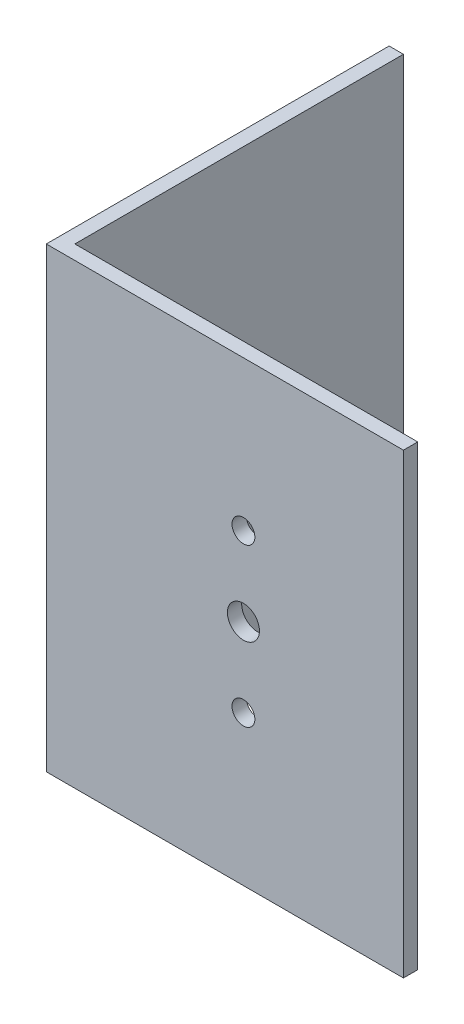
ISO-10303-21;
HEADER;
FILE_DESCRIPTION(('STEP AP214'),'2;1');
FILE_NAME('part.step','',(''),(''),'','','');
FILE_SCHEMA(('AUTOMOTIVE_DESIGN { 1 0 10303 214 1 1 1 1 }'));
ENDSEC;
DATA;
#1=APPLICATION_CONTEXT('core data for automotive mechanical design processes');
#2=APPLICATION_PROTOCOL_DEFINITION('international standard','automotive_design',2000,#1);
#3=PRODUCT_CONTEXT('',#1,'mechanical');
#4=PRODUCT('Part','Part','',(#3));
#5=PRODUCT_RELATED_PRODUCT_CATEGORY('part','',(#4));
#6=PRODUCT_DEFINITION_FORMATION('','',#4);
#7=PRODUCT_DEFINITION_CONTEXT('part definition',#1,'design');
#8=PRODUCT_DEFINITION('design','',#6,#7);
#9=PRODUCT_DEFINITION_SHAPE('','',#8);
#10=(LENGTH_UNIT() NAMED_UNIT(*) SI_UNIT(.MILLI.,.METRE.));
#11=(NAMED_UNIT(*) PLANE_ANGLE_UNIT() SI_UNIT($,.RADIAN.));
#12=(NAMED_UNIT(*) SI_UNIT($,.STERADIAN.) SOLID_ANGLE_UNIT());
#13=UNCERTAINTY_MEASURE_WITH_UNIT(LENGTH_MEASURE(1.E-05),#10,'distance_accuracy_value','');
#14=(GEOMETRIC_REPRESENTATION_CONTEXT(3) GLOBAL_UNCERTAINTY_ASSIGNED_CONTEXT((#13)) GLOBAL_UNIT_ASSIGNED_CONTEXT((#10,
#11,#12)) REPRESENTATION_CONTEXT('',''));
#15=CARTESIAN_POINT('',(0.,0.,0.));
#16=DIRECTION('',(0.,0.,1.));
#17=DIRECTION('',(1.,0.,0.));
#18=AXIS2_PLACEMENT_3D('',#15,#16,#17);
#19=CARTESIAN_POINT('',(1.5875,-25.4,19.05));
#20=DIRECTION('',(0.,0.,-1.));
#21=DIRECTION('',(-1.,0.,0.));
#22=AXIS2_PLACEMENT_3D('',#19,#20,#21);
#23=PLANE('',#22);
#24=CARTESIAN_POINT('',(21.9075,-8.763,19.05));
#25=DIRECTION('',(0.,0.,1.));
#26=DIRECTION('',(1.,0.,0.));
#27=AXIS2_PLACEMENT_3D('',#24,#25,#26);
#28=CIRCLE('',#27,1.27);
#29=CARTESIAN_POINT('',(23.1775,-8.763,19.05));
#30=VERTEX_POINT('',#29);
#31=EDGE_CURVE('E183',#30,#30,#28,.T.);
#32=ORIENTED_EDGE('',*,*,#31,.F.);
#33=EDGE_LOOP('',(#32));
#34=FACE_BOUND('',#33,.T.);
#35=CARTESIAN_POINT('',(21.9075,8.763,19.05));
#36=DIRECTION('',(0.,0.,1.));
#37=DIRECTION('',(1.,0.,0.));
#38=AXIS2_PLACEMENT_3D('',#35,#36,#37);
#39=CIRCLE('',#38,1.27);
#40=CARTESIAN_POINT('',(23.1775,8.763,19.05));
#41=VERTEX_POINT('',#40);
#42=EDGE_CURVE('E187',#41,#41,#39,.T.);
#43=ORIENTED_EDGE('',*,*,#42,.F.);
#44=EDGE_LOOP('',(#43));
#45=FACE_BOUND('',#44,.T.);
#46=CARTESIAN_POINT('',(21.9075,0.,19.05));
#47=DIRECTION('',(0.,0.,1.));
#48=DIRECTION('',(1.,0.,0.));
#49=AXIS2_PLACEMENT_3D('',#46,#47,#48);
#50=CIRCLE('',#49,1.778);
#51=CARTESIAN_POINT('',(23.6855,0.,19.05));
#52=VERTEX_POINT('',#51);
#53=EDGE_CURVE('E190',#52,#52,#50,.T.);
#54=ORIENTED_EDGE('',*,*,#53,.F.);
#55=EDGE_LOOP('',(#54));
#56=FACE_BOUND('',#55,.T.);
#57=DIRECTION('',(0.,-1.,0.));
#58=VECTOR('',#57,1.);
#59=CARTESIAN_POINT('',(0.,-25.4,19.05));
#60=LINE('',#59,#58);
#61=CARTESIAN_POINT('',(0.,25.4,19.05));
#62=VERTEX_POINT('',#61);
#63=CARTESIAN_POINT('',(0.,-25.4,19.05));
#64=VERTEX_POINT('',#63);
#65=EDGE_CURVE('E99',#62,#64,#60,.T.);
#66=ORIENTED_EDGE('',*,*,#65,.T.);
#67=DIRECTION('',(-1.,0.,0.));
#68=VECTOR('',#67,1.);
#69=CARTESIAN_POINT('',(1.5875,-25.4,19.05));
#70=LINE('',#69,#68);
#71=CARTESIAN_POINT('',(39.6875,-25.4,19.05));
#72=VERTEX_POINT('',#71);
#73=EDGE_CURVE('E11',#72,#64,#70,.T.);
#74=ORIENTED_EDGE('',*,*,#73,.F.);
#75=DIRECTION('',(0.,-1.,0.));
#76=VECTOR('',#75,1.);
#77=CARTESIAN_POINT('',(39.6875,-25.4,19.05));
#78=LINE('',#77,#76);
#79=CARTESIAN_POINT('',(39.6875,25.4,19.05));
#80=VERTEX_POINT('',#79);
#81=EDGE_CURVE('E101',#80,#72,#78,.T.);
#82=ORIENTED_EDGE('',*,*,#81,.F.);
#83=DIRECTION('',(-1.,0.,0.));
#84=VECTOR('',#83,1.);
#85=CARTESIAN_POINT('',(1.5875,25.4,19.05));
#86=LINE('',#85,#84);
#87=EDGE_CURVE('E84',#80,#62,#86,.T.);
#88=ORIENTED_EDGE('',*,*,#87,.T.);
#89=EDGE_LOOP('',(#66,#74,#82,#88));
#90=FACE_BOUND('',#89,.T.);
#91=ADVANCED_FACE('F39',(#34,#45,#56,#90),#23,.F.);
#92=CARTESIAN_POINT('',(1.5875,-25.4,-19.05));
#93=DIRECTION('',(0.,1.,0.));
#94=DIRECTION('',(0.,0.,1.));
#95=AXIS2_PLACEMENT_3D('',#92,#93,#94);
#96=PLANE('',#95);
#97=DIRECTION('',(0.,0.,-1.));
#98=VECTOR('',#97,1.);
#99=CARTESIAN_POINT('',(0.,-25.4,-19.05));
#100=LINE('',#99,#98);
#101=CARTESIAN_POINT('',(0.,-25.4,-19.05));
#102=VERTEX_POINT('',#101);
#103=EDGE_CURVE('E106',#64,#102,#100,.T.);
#104=ORIENTED_EDGE('',*,*,#103,.T.);
#105=DIRECTION('',(-1.,0.,0.));
#106=VECTOR('',#105,1.);
#107=CARTESIAN_POINT('',(1.5875,-25.4,-19.05));
#108=LINE('',#107,#106);
#109=CARTESIAN_POINT('',(1.5875,-25.4,-19.05));
#110=VERTEX_POINT('',#109);
#111=EDGE_CURVE('E47',#110,#102,#108,.T.);
#112=ORIENTED_EDGE('',*,*,#111,.F.);
#113=DIRECTION('',(0.,0.,-1.));
#114=VECTOR('',#113,1.);
#115=CARTESIAN_POINT('',(1.5875,-25.4,-19.05));
#116=LINE('',#115,#114);
#117=CARTESIAN_POINT('',(1.5875,-25.4,17.4625));
#118=VERTEX_POINT('',#117);
#119=EDGE_CURVE('E92',#118,#110,#116,.T.);
#120=ORIENTED_EDGE('',*,*,#119,.F.);
#121=DIRECTION('',(-1.,0.,0.));
#122=VECTOR('',#121,1.);
#123=CARTESIAN_POINT('',(39.6875,-25.4,17.4625));
#124=LINE('',#123,#122);
#125=CARTESIAN_POINT('',(39.6875,-25.4,17.4625));
#126=VERTEX_POINT('',#125);
#127=EDGE_CURVE('E108',#126,#118,#124,.T.);
#128=ORIENTED_EDGE('',*,*,#127,.F.);
#129=DIRECTION('',(0.,0.,-1.));
#130=VECTOR('',#129,1.);
#131=CARTESIAN_POINT('',(39.6875,-25.4,19.05));
#132=LINE('',#131,#130);
#133=EDGE_CURVE('E133',#72,#126,#132,.T.);
#134=ORIENTED_EDGE('',*,*,#133,.F.);
#135=ORIENTED_EDGE('',*,*,#73,.T.);
#136=EDGE_LOOP('',(#104,#112,#120,#128,#134,#135));
#137=FACE_BOUND('',#136,.T.);
#138=ADVANCED_FACE('F128',(#137),#96,.F.);
#139=CARTESIAN_POINT('',(1.5875,-25.4,-19.05));
#140=DIRECTION('',(0.,0.,1.));
#141=DIRECTION('',(1.,0.,0.));
#142=AXIS2_PLACEMENT_3D('',#139,#140,#141);
#143=PLANE('',#142);
#144=DIRECTION('',(0.,1.,0.));
#145=VECTOR('',#144,1.);
#146=CARTESIAN_POINT('',(0.,-25.4,-19.05));
#147=LINE('',#146,#145);
#148=CARTESIAN_POINT('',(0.,25.4,-19.05));
#149=VERTEX_POINT('',#148);
#150=EDGE_CURVE('E93',#102,#149,#147,.T.);
#151=ORIENTED_EDGE('',*,*,#150,.T.);
#152=DIRECTION('',(-1.,0.,0.));
#153=VECTOR('',#152,1.);
#154=CARTESIAN_POINT('',(1.5875,25.4,-19.05));
#155=LINE('',#154,#153);
#156=CARTESIAN_POINT('',(1.5875,25.4,-19.05));
#157=VERTEX_POINT('',#156);
#158=EDGE_CURVE('E87',#157,#149,#155,.T.);
#159=ORIENTED_EDGE('',*,*,#158,.F.);
#160=DIRECTION('',(0.,1.,0.));
#161=VECTOR('',#160,1.);
#162=CARTESIAN_POINT('',(1.5875,-25.4,-19.05));
#163=LINE('',#162,#161);
#164=EDGE_CURVE('E60',#110,#157,#163,.T.);
#165=ORIENTED_EDGE('',*,*,#164,.F.);
#166=ORIENTED_EDGE('',*,*,#111,.T.);
#167=EDGE_LOOP('',(#151,#159,#165,#166));
#168=FACE_BOUND('',#167,.T.);
#169=ADVANCED_FACE('F126',(#168),#143,.F.);
#170=CARTESIAN_POINT('',(1.5875,25.4,-19.05));
#171=DIRECTION('',(0.,-1.,0.));
#172=DIRECTION('',(0.,0.,-1.));
#173=AXIS2_PLACEMENT_3D('',#170,#171,#172);
#174=PLANE('',#173);
#175=DIRECTION('',(0.,0.,1.));
#176=VECTOR('',#175,1.);
#177=CARTESIAN_POINT('',(0.,25.4,-19.05));
#178=LINE('',#177,#176);
#179=EDGE_CURVE('E80',#149,#62,#178,.T.);
#180=ORIENTED_EDGE('',*,*,#179,.T.);
#181=ORIENTED_EDGE('',*,*,#87,.F.);
#182=DIRECTION('',(0.,0.,1.));
#183=VECTOR('',#182,1.);
#184=CARTESIAN_POINT('',(39.6875,25.4,19.05));
#185=LINE('',#184,#183);
#186=CARTESIAN_POINT('',(39.6875,25.4,17.4625));
#187=VERTEX_POINT('',#186);
#188=EDGE_CURVE('E147',#187,#80,#185,.T.);
#189=ORIENTED_EDGE('',*,*,#188,.F.);
#190=DIRECTION('',(-1.,0.,0.));
#191=VECTOR('',#190,1.);
#192=CARTESIAN_POINT('',(39.6875,25.4,17.4625));
#193=LINE('',#192,#191);
#194=CARTESIAN_POINT('',(1.5875,25.4,17.4625));
#195=VERTEX_POINT('',#194);
#196=EDGE_CURVE('E114',#187,#195,#193,.T.);
#197=ORIENTED_EDGE('',*,*,#196,.T.);
#198=DIRECTION('',(0.,0.,1.));
#199=VECTOR('',#198,1.);
#200=CARTESIAN_POINT('',(1.5875,25.4,-19.05));
#201=LINE('',#200,#199);
#202=EDGE_CURVE('E103',#157,#195,#201,.T.);
#203=ORIENTED_EDGE('',*,*,#202,.F.);
#204=ORIENTED_EDGE('',*,*,#158,.T.);
#205=EDGE_LOOP('',(#180,#181,#189,#197,#203,#204));
#206=FACE_BOUND('',#205,.T.);
#207=ADVANCED_FACE('F82',(#206),#174,.F.);
#208=CARTESIAN_POINT('',(1.5875,0.,0.));
#209=DIRECTION('',(1.,0.,0.));
#210=DIRECTION('',(0.,0.,-1.));
#211=AXIS2_PLACEMENT_3D('',#208,#209,#210);
#212=PLANE('',#211);
#213=DIRECTION('',(0.,1.,0.));
#214=VECTOR('',#213,1.);
#215=CARTESIAN_POINT('',(1.5875,-25.4,17.4625));
#216=LINE('',#215,#214);
#217=EDGE_CURVE('E54',#118,#195,#216,.T.);
#218=ORIENTED_EDGE('',*,*,#217,.F.);
#219=ORIENTED_EDGE('',*,*,#119,.T.);
#220=ORIENTED_EDGE('',*,*,#164,.T.);
#221=ORIENTED_EDGE('',*,*,#202,.T.);
#222=EDGE_LOOP('',(#218,#219,#220,#221));
#223=FACE_BOUND('',#222,.T.);
#224=ADVANCED_FACE('F165',(#223),#212,.T.);
#225=CARTESIAN_POINT('',(0.,0.,0.));
#226=DIRECTION('',(1.,0.,0.));
#227=DIRECTION('',(0.,0.,-1.));
#228=AXIS2_PLACEMENT_3D('',#225,#226,#227);
#229=PLANE('',#228);
#230=ORIENTED_EDGE('',*,*,#65,.F.);
#231=ORIENTED_EDGE('',*,*,#179,.F.);
#232=ORIENTED_EDGE('',*,*,#150,.F.);
#233=ORIENTED_EDGE('',*,*,#103,.F.);
#234=EDGE_LOOP('',(#230,#231,#232,#233));
#235=FACE_BOUND('',#234,.T.);
#236=ADVANCED_FACE('F105',(#235),#229,.F.);
#237=CARTESIAN_POINT('',(39.6875,-25.4,17.4625));
#238=DIRECTION('',(0.,0.,1.));
#239=DIRECTION('',(1.,0.,0.));
#240=AXIS2_PLACEMENT_3D('',#237,#238,#239);
#241=PLANE('',#240);
#242=CARTESIAN_POINT('',(21.9075,-8.763,17.4625));
#243=DIRECTION('',(0.,0.,1.));
#244=DIRECTION('',(1.,0.,0.));
#245=AXIS2_PLACEMENT_3D('',#242,#243,#244);
#246=CIRCLE('',#245,1.27);
#247=CARTESIAN_POINT('',(23.1775,-8.763,17.4625));
#248=VERTEX_POINT('',#247);
#249=EDGE_CURVE('E202',#248,#248,#246,.F.);
#250=ORIENTED_EDGE('',*,*,#249,.F.);
#251=EDGE_LOOP('',(#250));
#252=FACE_BOUND('',#251,.T.);
#253=CARTESIAN_POINT('',(21.9075,8.763,17.4625));
#254=DIRECTION('',(0.,0.,1.));
#255=DIRECTION('',(1.,0.,0.));
#256=AXIS2_PLACEMENT_3D('',#253,#254,#255);
#257=CIRCLE('',#256,1.27);
#258=CARTESIAN_POINT('',(23.1775,8.763,17.4625));
#259=VERTEX_POINT('',#258);
#260=EDGE_CURVE('E193',#259,#259,#257,.F.);
#261=ORIENTED_EDGE('',*,*,#260,.F.);
#262=EDGE_LOOP('',(#261));
#263=FACE_BOUND('',#262,.T.);
#264=CARTESIAN_POINT('',(21.9075,0.,17.4625));
#265=DIRECTION('',(0.,0.,1.));
#266=DIRECTION('',(1.,0.,0.));
#267=AXIS2_PLACEMENT_3D('',#264,#265,#266);
#268=CIRCLE('',#267,1.778);
#269=CARTESIAN_POINT('',(23.6855,0.,17.4625));
#270=VERTEX_POINT('',#269);
#271=EDGE_CURVE('E160',#270,#270,#268,.F.);
#272=ORIENTED_EDGE('',*,*,#271,.F.);
#273=EDGE_LOOP('',(#272));
#274=FACE_BOUND('',#273,.T.);
#275=ORIENTED_EDGE('',*,*,#217,.T.);
#276=ORIENTED_EDGE('',*,*,#196,.F.);
#277=DIRECTION('',(0.,1.,0.));
#278=VECTOR('',#277,1.);
#279=CARTESIAN_POINT('',(39.6875,-25.4,17.4625));
#280=LINE('',#279,#278);
#281=EDGE_CURVE('E144',#126,#187,#280,.T.);
#282=ORIENTED_EDGE('',*,*,#281,.F.);
#283=ORIENTED_EDGE('',*,*,#127,.T.);
#284=EDGE_LOOP('',(#275,#276,#282,#283));
#285=FACE_BOUND('',#284,.T.);
#286=ADVANCED_FACE('F152',(#252,#263,#274,#285),#241,.F.);
#287=CARTESIAN_POINT('',(39.6875,0.,0.));
#288=DIRECTION('',(-1.,0.,0.));
#289=DIRECTION('',(0.,0.,1.));
#290=AXIS2_PLACEMENT_3D('',#287,#288,#289);
#291=PLANE('',#290);
#292=ORIENTED_EDGE('',*,*,#81,.T.);
#293=ORIENTED_EDGE('',*,*,#133,.T.);
#294=ORIENTED_EDGE('',*,*,#281,.T.);
#295=ORIENTED_EDGE('',*,*,#188,.T.);
#296=EDGE_LOOP('',(#292,#293,#294,#295));
#297=FACE_BOUND('',#296,.T.);
#298=ADVANCED_FACE('F146',(#297),#291,.F.);
#299=CARTESIAN_POINT('',(21.9075,0.,-19.051));
#300=DIRECTION('',(0.,0.,1.));
#301=DIRECTION('',(1.,0.,0.));
#302=AXIS2_PLACEMENT_3D('',#299,#300,#301);
#303=CYLINDRICAL_SURFACE('',#302,1.778);
#304=ORIENTED_EDGE('',*,*,#53,.T.);
#305=EDGE_LOOP('',(#304));
#306=FACE_BOUND('',#305,.T.);
#307=ORIENTED_EDGE('',*,*,#271,.T.);
#308=EDGE_LOOP('',(#307));
#309=FACE_BOUND('',#308,.T.);
#310=ADVANCED_FACE('F217',(#306,#309),#303,.F.);
#311=CARTESIAN_POINT('',(21.9075,8.763,-19.051));
#312=DIRECTION('',(0.,0.,1.));
#313=DIRECTION('',(1.,0.,0.));
#314=AXIS2_PLACEMENT_3D('',#311,#312,#313);
#315=CYLINDRICAL_SURFACE('',#314,1.27);
#316=ORIENTED_EDGE('',*,*,#42,.T.);
#317=EDGE_LOOP('',(#316));
#318=FACE_BOUND('',#317,.T.);
#319=ORIENTED_EDGE('',*,*,#260,.T.);
#320=EDGE_LOOP('',(#319));
#321=FACE_BOUND('',#320,.T.);
#322=ADVANCED_FACE('F213',(#318,#321),#315,.F.);
#323=CARTESIAN_POINT('',(21.9075,-8.763,-19.051));
#324=DIRECTION('',(0.,0.,1.));
#325=DIRECTION('',(1.,0.,0.));
#326=AXIS2_PLACEMENT_3D('',#323,#324,#325);
#327=CYLINDRICAL_SURFACE('',#326,1.27);
#328=ORIENTED_EDGE('',*,*,#31,.T.);
#329=EDGE_LOOP('',(#328));
#330=FACE_BOUND('',#329,.T.);
#331=ORIENTED_EDGE('',*,*,#249,.T.);
#332=EDGE_LOOP('',(#331));
#333=FACE_BOUND('',#332,.T.);
#334=ADVANCED_FACE('F216',(#330,#333),#327,.F.);
#335=CLOSED_SHELL('',(#91,#138,#169,#207,#224,#236,#286,#298,#310,#322,#334));
#336=MANIFOLD_SOLID_BREP('B2',#335);
#337=ADVANCED_BREP_SHAPE_REPRESENTATION('',(#18,#336),#14);
#338=SHAPE_DEFINITION_REPRESENTATION(#9,#337);
ENDSEC;
END-ISO-10303-21;
